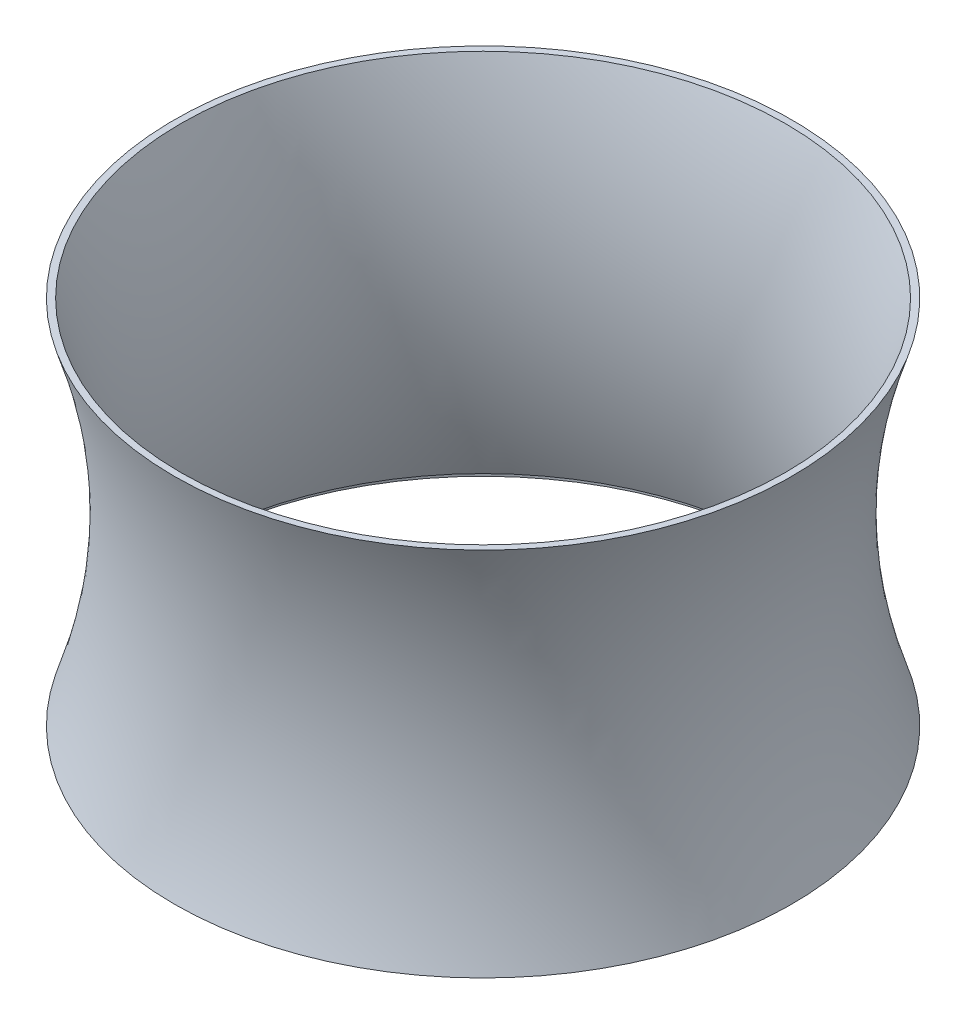
ISO-10303-21;
HEADER;
FILE_DESCRIPTION(('STEP AP214'),'2;1');
FILE_NAME('part.step','',(''),(''),'','','');
FILE_SCHEMA(('AUTOMOTIVE_DESIGN { 1 0 10303 214 1 1 1 1 }'));
ENDSEC;
DATA;
#1=APPLICATION_CONTEXT('core data for automotive mechanical design processes');
#2=APPLICATION_PROTOCOL_DEFINITION('international standard','automotive_design',2000,#1);
#3=PRODUCT_CONTEXT('',#1,'mechanical');
#4=PRODUCT('Part','Part','',(#3));
#5=PRODUCT_RELATED_PRODUCT_CATEGORY('part','',(#4));
#6=PRODUCT_DEFINITION_FORMATION('','',#4);
#7=PRODUCT_DEFINITION_CONTEXT('part definition',#1,'design');
#8=PRODUCT_DEFINITION('design','',#6,#7);
#9=PRODUCT_DEFINITION_SHAPE('','',#8);
#10=(LENGTH_UNIT() NAMED_UNIT(*) SI_UNIT(.MILLI.,.METRE.));
#11=(NAMED_UNIT(*) PLANE_ANGLE_UNIT() SI_UNIT($,.RADIAN.));
#12=(NAMED_UNIT(*) SI_UNIT($,.STERADIAN.) SOLID_ANGLE_UNIT());
#13=UNCERTAINTY_MEASURE_WITH_UNIT(LENGTH_MEASURE(1.E-05),#10,'distance_accuracy_value','');
#14=(GEOMETRIC_REPRESENTATION_CONTEXT(3) GLOBAL_UNCERTAINTY_ASSIGNED_CONTEXT((#13)) GLOBAL_UNIT_ASSIGNED_CONTEXT((#10,
#11,#12)) REPRESENTATION_CONTEXT('',''));
#15=CARTESIAN_POINT('',(0.,0.,0.));
#16=DIRECTION('',(0.,0.,1.));
#17=DIRECTION('',(1.,0.,0.));
#18=AXIS2_PLACEMENT_3D('',#15,#16,#17);
#19=CARTESIAN_POINT('',(0.,30.,0.));
#20=DIRECTION('',(0.,1.,0.));
#21=DIRECTION('',(0.,0.,1.));
#22=AXIS2_PLACEMENT_3D('',#19,#20,#21);
#23=PLANE('',#22);
#24=CARTESIAN_POINT('',(0.,30.,0.));
#25=DIRECTION('',(0.,1.,0.));
#26=DIRECTION('',(0.,0.,1.));
#27=AXIS2_PLACEMENT_3D('',#24,#25,#26);
#28=CIRCLE('',#27,48.9464577758403);
#29=CARTESIAN_POINT('',(0.,30.,48.9464577758403));
#30=VERTEX_POINT('',#29);
#31=EDGE_CURVE('E44',#30,#30,#28,.T.);
#32=ORIENTED_EDGE('',*,*,#31,.F.);
#33=EDGE_LOOP('',(#32));
#34=FACE_BOUND('',#33,.T.);
#35=CARTESIAN_POINT('',(0.,30.,0.));
#36=DIRECTION('',(0.,1.,0.));
#37=DIRECTION('',(0.,0.,1.));
#38=AXIS2_PLACEMENT_3D('',#35,#36,#37);
#39=CIRCLE('',#38,50.);
#40=CARTESIAN_POINT('',(0.,30.,50.));
#41=VERTEX_POINT('',#40);
#42=EDGE_CURVE('E10',#41,#41,#39,.T.);
#43=ORIENTED_EDGE('',*,*,#42,.T.);
#44=EDGE_LOOP('',(#43));
#45=FACE_BOUND('',#44,.T.);
#46=ADVANCED_FACE('F34',(#34,#45),#23,.T.);
#47=CARTESIAN_POINT('',(-50.,30.,0.));
#48=CARTESIAN_POINT('',(-40.,0.,0.));
#49=CARTESIAN_POINT('',(-50.,-30.,0.));
#50=B_SPLINE_CURVE_WITH_KNOTS('',2,(#47,#48,#49),.UNSPECIFIED.,.F.,.F.,(3,3),(0.,1.),.UNSPECIFIED.);
#51=CARTESIAN_POINT('',(0.,30.,0.));
#52=DIRECTION('',(0.,1.,0.));
#53=AXIS1_PLACEMENT('',#51,#52);
#54=SURFACE_OF_REVOLUTION('',#50,#53);
#55=CARTESIAN_POINT('',(0.,-30.,0.));
#56=DIRECTION('',(0.,1.,0.));
#57=DIRECTION('',(0.,0.,1.));
#58=AXIS2_PLACEMENT_3D('',#55,#56,#57);
#59=CIRCLE('',#58,50.);
#60=CARTESIAN_POINT('',(0.,-30.,50.));
#61=VERTEX_POINT('',#60);
#62=EDGE_CURVE('E40',#61,#61,#59,.T.);
#63=ORIENTED_EDGE('',*,*,#62,.T.);
#64=EDGE_LOOP('',(#63));
#65=FACE_BOUND('',#64,.T.);
#66=ORIENTED_EDGE('',*,*,#42,.F.);
#67=EDGE_LOOP('',(#66));
#68=FACE_BOUND('',#67,.T.);
#69=ADVANCED_FACE('F59',(#65,#68),#54,.F.);
#70=CARTESIAN_POINT('',(0.,-30.,0.));
#71=DIRECTION('',(0.,-1.,0.));
#72=DIRECTION('',(0.,0.,-1.));
#73=AXIS2_PLACEMENT_3D('',#70,#71,#72);
#74=PLANE('',#73);
#75=CARTESIAN_POINT('',(0.,-30.,0.));
#76=DIRECTION('',(0.,-1.,0.));
#77=DIRECTION('',(0.,0.,-1.));
#78=AXIS2_PLACEMENT_3D('',#75,#76,#77);
#79=CIRCLE('',#78,49.5);
#80=CARTESIAN_POINT('',(0.,-30.,-49.5));
#81=VERTEX_POINT('',#80);
#82=EDGE_CURVE('E120',#81,#81,#79,.T.);
#83=ORIENTED_EDGE('',*,*,#82,.F.);
#84=EDGE_LOOP('',(#83));
#85=FACE_BOUND('',#84,.T.);
#86=ORIENTED_EDGE('',*,*,#62,.F.);
#87=EDGE_LOOP('',(#86));
#88=FACE_BOUND('',#87,.T.);
#89=ADVANCED_FACE('F63',(#85,#88),#74,.T.);
#90=CARTESIAN_POINT('',(-50.,30.,0.));
#91=CARTESIAN_POINT('',(-40.,0.,0.));
#92=CARTESIAN_POINT('',(-50.,-30.,0.));
#93=B_SPLINE_CURVE_WITH_KNOTS('',2,(#90,#91,#92),.UNSPECIFIED.,.F.,.F.,(3,3),(0.,1.),.UNSPECIFIED.);
#94=CARTESIAN_POINT('',(0.,30.,0.));
#95=DIRECTION('',(0.,1.,0.));
#96=AXIS1_PLACEMENT('',#94,#95);
#97=SURFACE_OF_REVOLUTION('',#93,#96);
#98=OFFSET_SURFACE('',#97,1.,.F.);
#99=CARTESIAN_POINT('',(0.,-29.,0.));
#100=DIRECTION('',(0.,1.,0.));
#101=DIRECTION('',(0.,0.,1.));
#102=AXIS2_PLACEMENT_3D('',#99,#100,#101);
#103=CIRCLE('',#102,48.6221080286693);
#104=CARTESIAN_POINT('',(0.,-29.,48.6221080286693));
#105=VERTEX_POINT('',#104);
#106=EDGE_CURVE('E48',#105,#105,#103,.T.);
#107=ORIENTED_EDGE('',*,*,#106,.F.);
#108=EDGE_LOOP('',(#107));
#109=FACE_BOUND('',#108,.T.);
#110=ORIENTED_EDGE('',*,*,#31,.T.);
#111=EDGE_LOOP('',(#110));
#112=FACE_BOUND('',#111,.T.);
#113=ADVANCED_FACE('F64',(#109,#112),#98,.T.);
#114=CARTESIAN_POINT('',(0.,-29.,0.));
#115=DIRECTION('',(0.,-1.,0.));
#116=DIRECTION('',(0.,0.,-1.));
#117=AXIS2_PLACEMENT_3D('',#114,#115,#116);
#118=PLANE('',#117);
#119=CARTESIAN_POINT('',(0.,-29.,0.));
#120=DIRECTION('',(0.,-1.,0.));
#121=DIRECTION('',(0.,0.,-1.));
#122=AXIS2_PLACEMENT_3D('',#119,#120,#121);
#123=CIRCLE('',#122,49.5);
#124=CARTESIAN_POINT('',(0.,-29.,-49.5));
#125=VERTEX_POINT('',#124);
#126=EDGE_CURVE('E118',#125,#125,#123,.T.);
#127=ORIENTED_EDGE('',*,*,#126,.T.);
#128=EDGE_LOOP('',(#127));
#129=FACE_BOUND('',#128,.T.);
#130=ORIENTED_EDGE('',*,*,#106,.T.);
#131=EDGE_LOOP('',(#130));
#132=FACE_BOUND('',#131,.T.);
#133=ADVANCED_FACE('F73',(#129,#132),#118,.T.);
#134=CARTESIAN_POINT('',(0.,-29.,0.));
#135=DIRECTION('',(0.,-1.,0.));
#136=DIRECTION('',(0.,0.,-1.));
#137=AXIS2_PLACEMENT_3D('',#134,#135,#136);
#138=CYLINDRICAL_SURFACE('',#137,49.5);
#139=ORIENTED_EDGE('',*,*,#126,.F.);
#140=EDGE_LOOP('',(#139));
#141=FACE_BOUND('',#140,.T.);
#142=ORIENTED_EDGE('',*,*,#82,.T.);
#143=EDGE_LOOP('',(#142));
#144=FACE_BOUND('',#143,.T.);
#145=ADVANCED_FACE('F99',(#141,#144),#138,.F.);
#146=CLOSED_SHELL('',(#46,#69,#89,#113,#133,#145));
#147=MANIFOLD_SOLID_BREP('B2',#146);
#148=ADVANCED_BREP_SHAPE_REPRESENTATION('',(#18,#147),#14);
#149=SHAPE_DEFINITION_REPRESENTATION(#9,#148);
ENDSEC;
END-ISO-10303-21;
